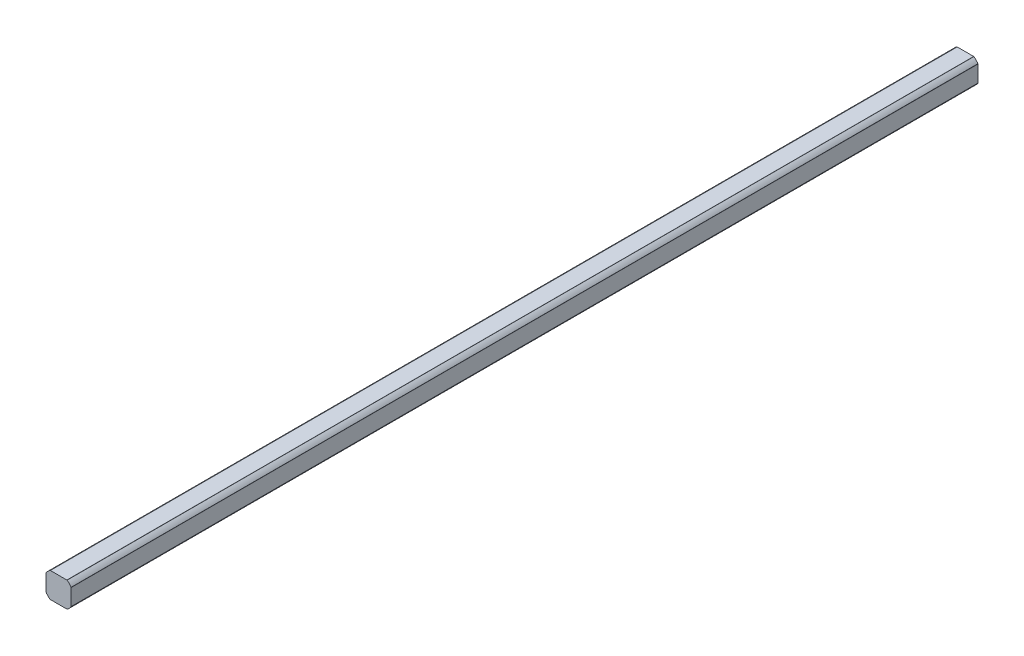
ISO-10303-21;
HEADER;
FILE_DESCRIPTION(('STEP AP214'),'2;1');
FILE_NAME('part.step','',(''),(''),'','','');
FILE_SCHEMA(('AUTOMOTIVE_DESIGN { 1 0 10303 214 1 1 1 1 }'));
ENDSEC;
DATA;
#1=APPLICATION_CONTEXT('core data for automotive mechanical design processes');
#2=APPLICATION_PROTOCOL_DEFINITION('international standard','automotive_design',2000,#1);
#3=PRODUCT_CONTEXT('',#1,'mechanical');
#4=PRODUCT('Part','Part','',(#3));
#5=PRODUCT_RELATED_PRODUCT_CATEGORY('part','',(#4));
#6=PRODUCT_DEFINITION_FORMATION('','',#4);
#7=PRODUCT_DEFINITION_CONTEXT('part definition',#1,'design');
#8=PRODUCT_DEFINITION('design','',#6,#7);
#9=PRODUCT_DEFINITION_SHAPE('','',#8);
#10=(LENGTH_UNIT() NAMED_UNIT(*) SI_UNIT(.MILLI.,.METRE.));
#11=(NAMED_UNIT(*) PLANE_ANGLE_UNIT() SI_UNIT($,.RADIAN.));
#12=(NAMED_UNIT(*) SI_UNIT($,.STERADIAN.) SOLID_ANGLE_UNIT());
#13=UNCERTAINTY_MEASURE_WITH_UNIT(LENGTH_MEASURE(1.E-05),#10,'distance_accuracy_value','');
#14=(GEOMETRIC_REPRESENTATION_CONTEXT(3) GLOBAL_UNCERTAINTY_ASSIGNED_CONTEXT((#13)) GLOBAL_UNIT_ASSIGNED_CONTEXT((#10,
#11,#12)) REPRESENTATION_CONTEXT('',''));
#15=CARTESIAN_POINT('',(0.,0.,0.));
#16=DIRECTION('',(0.,0.,1.));
#17=DIRECTION('',(1.,0.,0.));
#18=AXIS2_PLACEMENT_3D('',#15,#16,#17);
#19=CARTESIAN_POINT('',(0.,0.,304.8));
#20=DIRECTION('',(0.,0.,-1.));
#21=DIRECTION('',(-1.,0.,0.));
#22=AXIS2_PLACEMENT_3D('',#19,#20,#21);
#23=CYLINDRICAL_SURFACE('',#22,3.81);
#24=DIRECTION('',(0.,0.,1.));
#25=VECTOR('',#24,1.);
#26=CARTESIAN_POINT('',(3.15310344827586,-2.13870022314275,304.8));
#27=LINE('',#26,#25);
#28=CARTESIAN_POINT('',(3.15310344827586,-2.13870022314276,38.1));
#29=VERTEX_POINT('',#28);
#30=CARTESIAN_POINT('',(3.15310344827586,-2.13870022314276,266.7));
#31=VERTEX_POINT('',#30);
#32=EDGE_CURVE('E205',#29,#31,#27,.T.);
#33=ORIENTED_EDGE('',*,*,#32,.T.);
#34=CARTESIAN_POINT('',(0.,0.,266.7));
#35=DIRECTION('',(0.,0.,1.));
#36=DIRECTION('',(1.,0.,0.));
#37=AXIS2_PLACEMENT_3D('',#34,#35,#36);
#38=CIRCLE('',#37,3.81);
#39=CARTESIAN_POINT('',(2.13870022314276,-3.15310344827586,266.7));
#40=VERTEX_POINT('',#39);
#41=EDGE_CURVE('E180',#40,#31,#38,.T.);
#42=ORIENTED_EDGE('',*,*,#41,.F.);
#43=DIRECTION('',(0.,0.,-1.));
#44=VECTOR('',#43,1.);
#45=CARTESIAN_POINT('',(2.13870022314275,-3.15310344827586,304.8));
#46=LINE('',#45,#44);
#47=CARTESIAN_POINT('',(2.13870022314275,-3.15310344827586,38.1));
#48=VERTEX_POINT('',#47);
#49=EDGE_CURVE('E67',#40,#48,#46,.T.);
#50=ORIENTED_EDGE('',*,*,#49,.T.);
#51=CARTESIAN_POINT('',(0.,0.,38.1));
#52=DIRECTION('',(0.,0.,1.));
#53=DIRECTION('',(1.,0.,0.));
#54=AXIS2_PLACEMENT_3D('',#51,#52,#53);
#55=CIRCLE('',#54,3.81);
#56=EDGE_CURVE('E276',#48,#29,#55,.T.);
#57=ORIENTED_EDGE('',*,*,#56,.T.);
#58=EDGE_LOOP('',(#33,#42,#50,#57));
#59=FACE_BOUND('',#58,.T.);
#60=ADVANCED_FACE('F42',(#59),#23,.T.);
#61=CARTESIAN_POINT('',(3.175,2.10605674187568,304.8));
#62=DIRECTION('',(-1.,0.,0.));
#63=DIRECTION('',(0.,0.,1.));
#64=AXIS2_PLACEMENT_3D('',#61,#62,#63);
#65=PLANE('',#64);
#66=DIRECTION('',(0.,1.,0.));
#67=VECTOR('',#66,1.);
#68=CARTESIAN_POINT('',(3.175,2.10605674187568,266.7));
#69=LINE('',#68,#67);
#70=CARTESIAN_POINT('',(3.175,-2.06741021570466,266.7));
#71=VERTEX_POINT('',#70);
#72=CARTESIAN_POINT('',(3.175,2.06741021570466,266.7));
#73=VERTEX_POINT('',#72);
#74=EDGE_CURVE('E163',#71,#73,#69,.T.);
#75=ORIENTED_EDGE('',*,*,#74,.F.);
#76=DIRECTION('',(0.,0.,-1.));
#77=VECTOR('',#76,1.);
#78=CARTESIAN_POINT('',(3.175,-2.06741021570466,304.8));
#79=LINE('',#78,#77);
#80=CARTESIAN_POINT('',(3.175,-2.06741021570466,38.1));
#81=VERTEX_POINT('',#80);
#82=EDGE_CURVE('E185',#71,#81,#79,.T.);
#83=ORIENTED_EDGE('',*,*,#82,.T.);
#84=DIRECTION('',(0.,1.,0.));
#85=VECTOR('',#84,1.);
#86=CARTESIAN_POINT('',(3.175,2.10605674187568,38.1));
#87=LINE('',#86,#85);
#88=CARTESIAN_POINT('',(3.175,2.06741021570466,38.1));
#89=VERTEX_POINT('',#88);
#90=EDGE_CURVE('E287',#81,#89,#87,.T.);
#91=ORIENTED_EDGE('',*,*,#90,.T.);
#92=DIRECTION('',(0.,0.,1.));
#93=VECTOR('',#92,1.);
#94=CARTESIAN_POINT('',(3.175,2.06741021570466,304.8));
#95=LINE('',#94,#93);
#96=EDGE_CURVE('E184',#89,#73,#95,.T.);
#97=ORIENTED_EDGE('',*,*,#96,.T.);
#98=EDGE_LOOP('',(#75,#83,#91,#97));
#99=FACE_BOUND('',#98,.T.);
#100=ADVANCED_FACE('F304',(#99),#65,.F.);
#101=CARTESIAN_POINT('',(0.,0.,304.8));
#102=DIRECTION('',(0.,0.,-1.));
#103=DIRECTION('',(-1.,0.,0.));
#104=AXIS2_PLACEMENT_3D('',#101,#102,#103);
#105=CYLINDRICAL_SURFACE('',#104,3.81);
#106=DIRECTION('',(0.,0.,1.));
#107=VECTOR('',#106,1.);
#108=CARTESIAN_POINT('',(2.13870022314275,3.15310344827586,304.8));
#109=LINE('',#108,#107);
#110=CARTESIAN_POINT('',(2.13870022314276,3.15310344827586,38.1));
#111=VERTEX_POINT('',#110);
#112=CARTESIAN_POINT('',(2.13870022314276,3.15310344827586,266.7));
#113=VERTEX_POINT('',#112);
#114=EDGE_CURVE('E177',#111,#113,#109,.T.);
#115=ORIENTED_EDGE('',*,*,#114,.T.);
#116=CARTESIAN_POINT('',(3.15310344827586,2.13870022314276,266.7));
#117=VERTEX_POINT('',#116);
#118=EDGE_CURVE('E160',#117,#113,#38,.T.);
#119=ORIENTED_EDGE('',*,*,#118,.F.);
#120=DIRECTION('',(0.,0.,-1.));
#121=VECTOR('',#120,1.);
#122=CARTESIAN_POINT('',(3.15310344827586,2.13870022314275,304.8));
#123=LINE('',#122,#121);
#124=CARTESIAN_POINT('',(3.15310344827586,2.13870022314276,38.1));
#125=VERTEX_POINT('',#124);
#126=EDGE_CURVE('E174',#117,#125,#123,.T.);
#127=ORIENTED_EDGE('',*,*,#126,.T.);
#128=EDGE_CURVE('E277',#125,#111,#55,.T.);
#129=ORIENTED_EDGE('',*,*,#128,.T.);
#130=EDGE_LOOP('',(#115,#119,#127,#129));
#131=FACE_BOUND('',#130,.T.);
#132=ADVANCED_FACE('F172',(#131),#105,.T.);
#133=CARTESIAN_POINT('',(-2.10605674187568,3.175,304.8));
#134=DIRECTION('',(0.,-1.,0.));
#135=DIRECTION('',(0.,0.,-1.));
#136=AXIS2_PLACEMENT_3D('',#133,#134,#135);
#137=PLANE('',#136);
#138=DIRECTION('',(-1.,0.,0.));
#139=VECTOR('',#138,1.);
#140=CARTESIAN_POINT('',(-2.10605674187568,3.175,266.7));
#141=LINE('',#140,#139);
#142=CARTESIAN_POINT('',(2.06741021570467,3.175,266.7));
#143=VERTEX_POINT('',#142);
#144=CARTESIAN_POINT('',(-2.06741021570466,3.175,266.7));
#145=VERTEX_POINT('',#144);
#146=EDGE_CURVE('E272',#143,#145,#141,.T.);
#147=ORIENTED_EDGE('',*,*,#146,.F.);
#148=DIRECTION('',(0.,0.,-1.));
#149=VECTOR('',#148,1.);
#150=CARTESIAN_POINT('',(2.06741021570466,3.175,304.8));
#151=LINE('',#150,#149);
#152=CARTESIAN_POINT('',(2.06741021570467,3.175,38.1));
#153=VERTEX_POINT('',#152);
#154=EDGE_CURVE('E46',#143,#153,#151,.T.);
#155=ORIENTED_EDGE('',*,*,#154,.T.);
#156=DIRECTION('',(-1.,0.,0.));
#157=VECTOR('',#156,1.);
#158=CARTESIAN_POINT('',(-2.10605674187568,3.175,38.1));
#159=LINE('',#158,#157);
#160=CARTESIAN_POINT('',(-2.06741021570466,3.175,38.1));
#161=VERTEX_POINT('',#160);
#162=EDGE_CURVE('E297',#153,#161,#159,.T.);
#163=ORIENTED_EDGE('',*,*,#162,.T.);
#164=DIRECTION('',(0.,0.,1.));
#165=VECTOR('',#164,1.);
#166=CARTESIAN_POINT('',(-2.06741021570466,3.175,304.8));
#167=LINE('',#166,#165);
#168=EDGE_CURVE('E201',#161,#145,#167,.T.);
#169=ORIENTED_EDGE('',*,*,#168,.T.);
#170=EDGE_LOOP('',(#147,#155,#163,#169));
#171=FACE_BOUND('',#170,.T.);
#172=ADVANCED_FACE('F389',(#171),#137,.F.);
#173=CARTESIAN_POINT('',(0.,0.,304.8));
#174=DIRECTION('',(0.,0.,-1.));
#175=DIRECTION('',(-1.,0.,0.));
#176=AXIS2_PLACEMENT_3D('',#173,#174,#175);
#177=CYLINDRICAL_SURFACE('',#176,3.81);
#178=DIRECTION('',(0.,0.,1.));
#179=VECTOR('',#178,1.);
#180=CARTESIAN_POINT('',(-3.15310344827586,2.13870022314275,304.8));
#181=LINE('',#180,#179);
#182=CARTESIAN_POINT('',(-3.15310344827586,2.13870022314276,38.1));
#183=VERTEX_POINT('',#182);
#184=CARTESIAN_POINT('',(-3.15310344827586,2.13870022314276,266.7));
#185=VERTEX_POINT('',#184);
#186=EDGE_CURVE('E241',#183,#185,#181,.T.);
#187=ORIENTED_EDGE('',*,*,#186,.T.);
#188=CARTESIAN_POINT('',(-2.13870022314276,3.15310344827586,266.7));
#189=VERTEX_POINT('',#188);
#190=EDGE_CURVE('E178',#189,#185,#38,.T.);
#191=ORIENTED_EDGE('',*,*,#190,.F.);
#192=DIRECTION('',(0.,0.,-1.));
#193=VECTOR('',#192,1.);
#194=CARTESIAN_POINT('',(-2.13870022314275,3.15310344827586,304.8));
#195=LINE('',#194,#193);
#196=CARTESIAN_POINT('',(-2.13870022314276,3.15310344827586,38.1));
#197=VERTEX_POINT('',#196);
#198=EDGE_CURVE('E190',#189,#197,#195,.T.);
#199=ORIENTED_EDGE('',*,*,#198,.T.);
#200=EDGE_CURVE('E280',#197,#183,#55,.T.);
#201=ORIENTED_EDGE('',*,*,#200,.T.);
#202=EDGE_LOOP('',(#187,#191,#199,#201));
#203=FACE_BOUND('',#202,.T.);
#204=ADVANCED_FACE('F323',(#203),#177,.T.);
#205=CARTESIAN_POINT('',(-3.175,2.10605674187568,304.8));
#206=DIRECTION('',(1.,0.,0.));
#207=DIRECTION('',(0.,1.,0.));
#208=AXIS2_PLACEMENT_3D('',#205,#206,#207);
#209=PLANE('',#208);
#210=DIRECTION('',(0.,-1.,0.));
#211=VECTOR('',#210,1.);
#212=CARTESIAN_POINT('',(-3.175,2.10605674187568,266.7));
#213=LINE('',#212,#211);
#214=CARTESIAN_POINT('',(-3.175,2.06741021570466,266.7));
#215=VERTEX_POINT('',#214);
#216=CARTESIAN_POINT('',(-3.175,-2.06741021570466,266.7));
#217=VERTEX_POINT('',#216);
#218=EDGE_CURVE('E253',#215,#217,#213,.T.);
#219=ORIENTED_EDGE('',*,*,#218,.F.);
#220=DIRECTION('',(0.,0.,-1.));
#221=VECTOR('',#220,1.);
#222=CARTESIAN_POINT('',(-3.175,2.06741021570466,304.8));
#223=LINE('',#222,#221);
#224=CARTESIAN_POINT('',(-3.175,2.06741021570466,38.1));
#225=VERTEX_POINT('',#224);
#226=EDGE_CURVE('E240',#215,#225,#223,.T.);
#227=ORIENTED_EDGE('',*,*,#226,.T.);
#228=DIRECTION('',(0.,-1.,0.));
#229=VECTOR('',#228,1.);
#230=CARTESIAN_POINT('',(-3.175,2.10605674187568,38.1));
#231=LINE('',#230,#229);
#232=CARTESIAN_POINT('',(-3.175,-2.06741021570466,38.1));
#233=VERTEX_POINT('',#232);
#234=EDGE_CURVE('E254',#225,#233,#231,.T.);
#235=ORIENTED_EDGE('',*,*,#234,.T.);
#236=DIRECTION('',(0.,0.,1.));
#237=VECTOR('',#236,1.);
#238=CARTESIAN_POINT('',(-3.175,-2.06741021570466,304.8));
#239=LINE('',#238,#237);
#240=EDGE_CURVE('E232',#233,#217,#239,.T.);
#241=ORIENTED_EDGE('',*,*,#240,.T.);
#242=EDGE_LOOP('',(#219,#227,#235,#241));
#243=FACE_BOUND('',#242,.T.);
#244=ADVANCED_FACE('F252',(#243),#209,.F.);
#245=CARTESIAN_POINT('',(0.,0.,304.8));
#246=DIRECTION('',(0.,0.,-1.));
#247=DIRECTION('',(-1.,0.,0.));
#248=AXIS2_PLACEMENT_3D('',#245,#246,#247);
#249=CYLINDRICAL_SURFACE('',#248,3.81);
#250=DIRECTION('',(0.,0.,1.));
#251=VECTOR('',#250,1.);
#252=CARTESIAN_POINT('',(-2.13870022314275,-3.15310344827586,304.8));
#253=LINE('',#252,#251);
#254=CARTESIAN_POINT('',(-2.13870022314276,-3.15310344827586,38.1));
#255=VERTEX_POINT('',#254);
#256=CARTESIAN_POINT('',(-2.13870022314276,-3.15310344827586,266.7));
#257=VERTEX_POINT('',#256);
#258=EDGE_CURVE('E228',#255,#257,#253,.T.);
#259=ORIENTED_EDGE('',*,*,#258,.T.);
#260=CARTESIAN_POINT('',(-3.15310344827586,-2.13870022314276,266.7));
#261=VERTEX_POINT('',#260);
#262=EDGE_CURVE('E330',#261,#257,#38,.T.);
#263=ORIENTED_EDGE('',*,*,#262,.F.);
#264=DIRECTION('',(0.,0.,-1.));
#265=VECTOR('',#264,1.);
#266=CARTESIAN_POINT('',(-3.15310344827586,-2.13870022314275,304.8));
#267=LINE('',#266,#265);
#268=CARTESIAN_POINT('',(-3.15310344827586,-2.13870022314276,38.1));
#269=VERTEX_POINT('',#268);
#270=EDGE_CURVE('E231',#261,#269,#267,.T.);
#271=ORIENTED_EDGE('',*,*,#270,.T.);
#272=EDGE_CURVE('E314',#269,#255,#55,.T.);
#273=ORIENTED_EDGE('',*,*,#272,.T.);
#274=EDGE_LOOP('',(#259,#263,#271,#273));
#275=FACE_BOUND('',#274,.T.);
#276=ADVANCED_FACE('F340',(#275),#249,.T.);
#277=CARTESIAN_POINT('',(-2.10605674187568,-3.175,304.8));
#278=DIRECTION('',(0.,1.,0.));
#279=DIRECTION('',(1.,0.,0.));
#280=AXIS2_PLACEMENT_3D('',#277,#278,#279);
#281=PLANE('',#280);
#282=DIRECTION('',(1.,0.,0.));
#283=VECTOR('',#282,1.);
#284=CARTESIAN_POINT('',(-2.10605674187568,-3.175,266.7));
#285=LINE('',#284,#283);
#286=CARTESIAN_POINT('',(-2.06741021570466,-3.175,266.7));
#287=VERTEX_POINT('',#286);
#288=CARTESIAN_POINT('',(2.06741021570466,-3.175,266.7));
#289=VERTEX_POINT('',#288);
#290=EDGE_CURVE('E60',#287,#289,#285,.T.);
#291=ORIENTED_EDGE('',*,*,#290,.F.);
#292=DIRECTION('',(0.,0.,-1.));
#293=VECTOR('',#292,1.);
#294=CARTESIAN_POINT('',(-2.06741021570466,-3.175,304.8));
#295=LINE('',#294,#293);
#296=CARTESIAN_POINT('',(-2.06741021570466,-3.175,38.1));
#297=VERTEX_POINT('',#296);
#298=EDGE_CURVE('E221',#287,#297,#295,.T.);
#299=ORIENTED_EDGE('',*,*,#298,.T.);
#300=DIRECTION('',(1.,0.,0.));
#301=VECTOR('',#300,1.);
#302=CARTESIAN_POINT('',(-2.10605674187568,-3.175,38.1));
#303=LINE('',#302,#301);
#304=CARTESIAN_POINT('',(2.06741021570466,-3.175,38.1));
#305=VERTEX_POINT('',#304);
#306=EDGE_CURVE('E279',#297,#305,#303,.T.);
#307=ORIENTED_EDGE('',*,*,#306,.T.);
#308=DIRECTION('',(0.,0.,1.));
#309=VECTOR('',#308,1.);
#310=CARTESIAN_POINT('',(2.06741021570466,-3.175,304.8));
#311=LINE('',#310,#309);
#312=EDGE_CURVE('E217',#305,#289,#311,.T.);
#313=ORIENTED_EDGE('',*,*,#312,.T.);
#314=EDGE_LOOP('',(#291,#299,#307,#313));
#315=FACE_BOUND('',#314,.T.);
#316=ADVANCED_FACE('F344',(#315),#281,.F.);
#317=CARTESIAN_POINT('',(2.06741021570466,3.048,304.8));
#318=DIRECTION('',(0.,0.,-1.));
#319=DIRECTION('',(-1.,0.,0.));
#320=AXIS2_PLACEMENT_3D('',#317,#318,#319);
#321=CYLINDRICAL_SURFACE('',#320,0.127);
#322=ORIENTED_EDGE('',*,*,#154,.F.);
#323=CARTESIAN_POINT('',(2.06741021570466,3.048,266.7));
#324=DIRECTION('',(0.,0.,1.));
#325=DIRECTION('',(1.,0.,0.));
#326=AXIS2_PLACEMENT_3D('',#323,#324,#325);
#327=CIRCLE('',#326,0.127);
#328=EDGE_CURVE('E274',#143,#113,#327,.F.);
#329=ORIENTED_EDGE('',*,*,#328,.T.);
#330=ORIENTED_EDGE('',*,*,#114,.F.);
#331=CARTESIAN_POINT('',(2.06741021570466,3.048,38.1));
#332=DIRECTION('',(0.,0.,1.));
#333=DIRECTION('',(1.,0.,0.));
#334=AXIS2_PLACEMENT_3D('',#331,#332,#333);
#335=CIRCLE('',#334,0.127);
#336=EDGE_CURVE('E222',#153,#111,#335,.F.);
#337=ORIENTED_EDGE('',*,*,#336,.F.);
#338=EDGE_LOOP('',(#322,#329,#330,#337));
#339=FACE_BOUND('',#338,.T.);
#340=ADVANCED_FACE('F364',(#339),#321,.T.);
#341=CARTESIAN_POINT('',(3.048,2.06741021570466,304.8));
#342=DIRECTION('',(0.,0.,-1.));
#343=DIRECTION('',(-1.,0.,0.));
#344=AXIS2_PLACEMENT_3D('',#341,#342,#343);
#345=CYLINDRICAL_SURFACE('',#344,0.127);
#346=ORIENTED_EDGE('',*,*,#126,.F.);
#347=CARTESIAN_POINT('',(3.048,2.06741021570466,266.7));
#348=DIRECTION('',(0.,0.,1.));
#349=DIRECTION('',(1.,0.,0.));
#350=AXIS2_PLACEMENT_3D('',#347,#348,#349);
#351=CIRCLE('',#350,0.127);
#352=EDGE_CURVE('E157',#117,#73,#351,.F.);
#353=ORIENTED_EDGE('',*,*,#352,.T.);
#354=ORIENTED_EDGE('',*,*,#96,.F.);
#355=CARTESIAN_POINT('',(3.048,2.06741021570466,38.1));
#356=DIRECTION('',(0.,0.,1.));
#357=DIRECTION('',(1.,0.,0.));
#358=AXIS2_PLACEMENT_3D('',#355,#356,#357);
#359=CIRCLE('',#358,0.127);
#360=EDGE_CURVE('E183',#125,#89,#359,.F.);
#361=ORIENTED_EDGE('',*,*,#360,.F.);
#362=EDGE_LOOP('',(#346,#353,#354,#361));
#363=FACE_BOUND('',#362,.T.);
#364=ADVANCED_FACE('F182',(#363),#345,.T.);
#365=CARTESIAN_POINT('',(-2.06741021570466,3.048,304.8));
#366=DIRECTION('',(0.,0.,-1.));
#367=DIRECTION('',(-1.,0.,0.));
#368=AXIS2_PLACEMENT_3D('',#365,#366,#367);
#369=CYLINDRICAL_SURFACE('',#368,0.127);
#370=ORIENTED_EDGE('',*,*,#198,.F.);
#371=CARTESIAN_POINT('',(-2.06741021570466,3.048,266.7));
#372=DIRECTION('',(0.,0.,1.));
#373=DIRECTION('',(1.,0.,0.));
#374=AXIS2_PLACEMENT_3D('',#371,#372,#373);
#375=CIRCLE('',#374,0.127);
#376=EDGE_CURVE('E269',#189,#145,#375,.F.);
#377=ORIENTED_EDGE('',*,*,#376,.T.);
#378=ORIENTED_EDGE('',*,*,#168,.F.);
#379=CARTESIAN_POINT('',(-2.06741021570466,3.048,38.1));
#380=DIRECTION('',(0.,0.,1.));
#381=DIRECTION('',(1.,0.,0.));
#382=AXIS2_PLACEMENT_3D('',#379,#380,#381);
#383=CIRCLE('',#382,0.127);
#384=EDGE_CURVE('E295',#197,#161,#383,.F.);
#385=ORIENTED_EDGE('',*,*,#384,.F.);
#386=EDGE_LOOP('',(#370,#377,#378,#385));
#387=FACE_BOUND('',#386,.T.);
#388=ADVANCED_FACE('F44',(#387),#369,.T.);
#389=CARTESIAN_POINT('',(-3.048,2.06741021570466,304.8));
#390=DIRECTION('',(0.,0.,-1.));
#391=DIRECTION('',(-1.,0.,0.));
#392=AXIS2_PLACEMENT_3D('',#389,#390,#391);
#393=CYLINDRICAL_SURFACE('',#392,0.127);
#394=ORIENTED_EDGE('',*,*,#226,.F.);
#395=CARTESIAN_POINT('',(-3.048,2.06741021570466,266.7));
#396=DIRECTION('',(0.,0.,1.));
#397=DIRECTION('',(1.,0.,0.));
#398=AXIS2_PLACEMENT_3D('',#395,#396,#397);
#399=CIRCLE('',#398,0.127);
#400=EDGE_CURVE('E263',#215,#185,#399,.F.);
#401=ORIENTED_EDGE('',*,*,#400,.T.);
#402=ORIENTED_EDGE('',*,*,#186,.F.);
#403=CARTESIAN_POINT('',(-3.048,2.06741021570466,38.1));
#404=DIRECTION('',(0.,0.,1.));
#405=DIRECTION('',(1.,0.,0.));
#406=AXIS2_PLACEMENT_3D('',#403,#404,#405);
#407=CIRCLE('',#406,0.127);
#408=EDGE_CURVE('E293',#225,#183,#407,.F.);
#409=ORIENTED_EDGE('',*,*,#408,.F.);
#410=EDGE_LOOP('',(#394,#401,#402,#409));
#411=FACE_BOUND('',#410,.T.);
#412=ADVANCED_FACE('F329',(#411),#393,.T.);
#413=CARTESIAN_POINT('',(-3.048,-2.06741021570466,304.8));
#414=DIRECTION('',(0.,0.,-1.));
#415=DIRECTION('',(-1.,0.,0.));
#416=AXIS2_PLACEMENT_3D('',#413,#414,#415);
#417=CYLINDRICAL_SURFACE('',#416,0.127);
#418=ORIENTED_EDGE('',*,*,#270,.F.);
#419=CARTESIAN_POINT('',(-3.048,-2.06741021570466,266.7));
#420=DIRECTION('',(0.,0.,1.));
#421=DIRECTION('',(1.,0.,0.));
#422=AXIS2_PLACEMENT_3D('',#419,#420,#421);
#423=CIRCLE('',#422,0.127);
#424=EDGE_CURVE('E168',#261,#217,#423,.F.);
#425=ORIENTED_EDGE('',*,*,#424,.T.);
#426=ORIENTED_EDGE('',*,*,#240,.F.);
#427=CARTESIAN_POINT('',(-3.048,-2.06741021570466,38.1));
#428=DIRECTION('',(0.,0.,1.));
#429=DIRECTION('',(1.,0.,0.));
#430=AXIS2_PLACEMENT_3D('',#427,#428,#429);
#431=CIRCLE('',#430,0.127);
#432=EDGE_CURVE('E260',#269,#233,#431,.F.);
#433=ORIENTED_EDGE('',*,*,#432,.F.);
#434=EDGE_LOOP('',(#418,#425,#426,#433));
#435=FACE_BOUND('',#434,.T.);
#436=ADVANCED_FACE('F259',(#435),#417,.T.);
#437=CARTESIAN_POINT('',(-2.06741021570466,-3.048,304.8));
#438=DIRECTION('',(0.,0.,-1.));
#439=DIRECTION('',(-1.,0.,0.));
#440=AXIS2_PLACEMENT_3D('',#437,#438,#439);
#441=CYLINDRICAL_SURFACE('',#440,0.127);
#442=ORIENTED_EDGE('',*,*,#298,.F.);
#443=CARTESIAN_POINT('',(-2.06741021570466,-3.048,266.7));
#444=DIRECTION('',(0.,0.,1.));
#445=DIRECTION('',(1.,0.,0.));
#446=AXIS2_PLACEMENT_3D('',#443,#444,#445);
#447=CIRCLE('',#446,0.127);
#448=EDGE_CURVE('E333',#287,#257,#447,.F.);
#449=ORIENTED_EDGE('',*,*,#448,.T.);
#450=ORIENTED_EDGE('',*,*,#258,.F.);
#451=CARTESIAN_POINT('',(-2.06741021570466,-3.048,38.1));
#452=DIRECTION('',(0.,0.,1.));
#453=DIRECTION('',(1.,0.,0.));
#454=AXIS2_PLACEMENT_3D('',#451,#452,#453);
#455=CIRCLE('',#454,0.127);
#456=EDGE_CURVE('E283',#297,#255,#455,.F.);
#457=ORIENTED_EDGE('',*,*,#456,.F.);
#458=EDGE_LOOP('',(#442,#449,#450,#457));
#459=FACE_BOUND('',#458,.T.);
#460=ADVANCED_FACE('F338',(#459),#441,.T.);
#461=CARTESIAN_POINT('',(3.048,-2.06741021570466,304.8));
#462=DIRECTION('',(0.,0.,-1.));
#463=DIRECTION('',(-1.,0.,0.));
#464=AXIS2_PLACEMENT_3D('',#461,#462,#463);
#465=CYLINDRICAL_SURFACE('',#464,0.127);
#466=ORIENTED_EDGE('',*,*,#82,.F.);
#467=CARTESIAN_POINT('',(3.048,-2.06741021570466,266.7));
#468=DIRECTION('',(0.,0.,1.));
#469=DIRECTION('',(1.,0.,0.));
#470=AXIS2_PLACEMENT_3D('',#467,#468,#469);
#471=CIRCLE('',#470,0.127);
#472=EDGE_CURVE('E312',#71,#31,#471,.F.);
#473=ORIENTED_EDGE('',*,*,#472,.T.);
#474=ORIENTED_EDGE('',*,*,#32,.F.);
#475=CARTESIAN_POINT('',(3.048,-2.06741021570466,38.1));
#476=DIRECTION('',(0.,0.,1.));
#477=DIRECTION('',(1.,0.,0.));
#478=AXIS2_PLACEMENT_3D('',#475,#476,#477);
#479=CIRCLE('',#478,0.127);
#480=EDGE_CURVE('E285',#81,#29,#479,.F.);
#481=ORIENTED_EDGE('',*,*,#480,.F.);
#482=EDGE_LOOP('',(#466,#473,#474,#481));
#483=FACE_BOUND('',#482,.T.);
#484=ADVANCED_FACE('F311',(#483),#465,.T.);
#485=CARTESIAN_POINT('',(2.06741021570466,-3.048,304.8));
#486=DIRECTION('',(0.,0.,-1.));
#487=DIRECTION('',(-1.,0.,0.));
#488=AXIS2_PLACEMENT_3D('',#485,#486,#487);
#489=CYLINDRICAL_SURFACE('',#488,0.127);
#490=ORIENTED_EDGE('',*,*,#49,.F.);
#491=CARTESIAN_POINT('',(2.06741021570466,-3.048,266.7));
#492=DIRECTION('',(0.,0.,1.));
#493=DIRECTION('',(1.,0.,0.));
#494=AXIS2_PLACEMENT_3D('',#491,#492,#493);
#495=CIRCLE('',#494,0.127);
#496=EDGE_CURVE('E11',#40,#289,#495,.F.);
#497=ORIENTED_EDGE('',*,*,#496,.T.);
#498=ORIENTED_EDGE('',*,*,#312,.F.);
#499=CARTESIAN_POINT('',(2.06741021570466,-3.048,38.1));
#500=DIRECTION('',(0.,0.,1.));
#501=DIRECTION('',(1.,0.,0.));
#502=AXIS2_PLACEMENT_3D('',#499,#500,#501);
#503=CIRCLE('',#502,0.127);
#504=EDGE_CURVE('E52',#48,#305,#503,.F.);
#505=ORIENTED_EDGE('',*,*,#504,.F.);
#506=EDGE_LOOP('',(#490,#497,#498,#505));
#507=FACE_BOUND('',#506,.T.);
#508=ADVANCED_FACE('F346',(#507),#489,.T.);
#509=CARTESIAN_POINT('',(0.,0.,38.1));
#510=DIRECTION('',(0.,0.,1.));
#511=DIRECTION('',(1.,0.,0.));
#512=AXIS2_PLACEMENT_3D('',#509,#510,#511);
#513=PLANE('',#512);
#514=ORIENTED_EDGE('',*,*,#336,.T.);
#515=ORIENTED_EDGE('',*,*,#128,.F.);
#516=ORIENTED_EDGE('',*,*,#360,.T.);
#517=ORIENTED_EDGE('',*,*,#90,.F.);
#518=ORIENTED_EDGE('',*,*,#480,.T.);
#519=ORIENTED_EDGE('',*,*,#56,.F.);
#520=ORIENTED_EDGE('',*,*,#504,.T.);
#521=ORIENTED_EDGE('',*,*,#306,.F.);
#522=ORIENTED_EDGE('',*,*,#456,.T.);
#523=ORIENTED_EDGE('',*,*,#272,.F.);
#524=ORIENTED_EDGE('',*,*,#432,.T.);
#525=ORIENTED_EDGE('',*,*,#234,.F.);
#526=ORIENTED_EDGE('',*,*,#408,.T.);
#527=ORIENTED_EDGE('',*,*,#200,.F.);
#528=ORIENTED_EDGE('',*,*,#384,.T.);
#529=ORIENTED_EDGE('',*,*,#162,.F.);
#530=EDGE_LOOP('',(#514,#515,#516,#517,#518,#519,#520,#521,#522,#523,#524,#525,#526,#527,#528,#529));
#531=FACE_BOUND('',#530,.T.);
#532=ADVANCED_FACE('F309',(#531),#513,.F.);
#533=CARTESIAN_POINT('',(0.,0.,266.7));
#534=DIRECTION('',(0.,0.,1.));
#535=DIRECTION('',(1.,0.,0.));
#536=AXIS2_PLACEMENT_3D('',#533,#534,#535);
#537=PLANE('',#536);
#538=ORIENTED_EDGE('',*,*,#146,.T.);
#539=ORIENTED_EDGE('',*,*,#376,.F.);
#540=ORIENTED_EDGE('',*,*,#190,.T.);
#541=ORIENTED_EDGE('',*,*,#400,.F.);
#542=ORIENTED_EDGE('',*,*,#218,.T.);
#543=ORIENTED_EDGE('',*,*,#424,.F.);
#544=ORIENTED_EDGE('',*,*,#262,.T.);
#545=ORIENTED_EDGE('',*,*,#448,.F.);
#546=ORIENTED_EDGE('',*,*,#290,.T.);
#547=ORIENTED_EDGE('',*,*,#496,.F.);
#548=ORIENTED_EDGE('',*,*,#41,.T.);
#549=ORIENTED_EDGE('',*,*,#472,.F.);
#550=ORIENTED_EDGE('',*,*,#74,.T.);
#551=ORIENTED_EDGE('',*,*,#352,.F.);
#552=ORIENTED_EDGE('',*,*,#118,.T.);
#553=ORIENTED_EDGE('',*,*,#328,.F.);
#554=EDGE_LOOP('',(#538,#539,#540,#541,#542,#543,#544,#545,#546,#547,#548,#549,#550,#551,#552,#553));
#555=FACE_BOUND('',#554,.T.);
#556=ADVANCED_FACE('F159',(#555),#537,.T.);
#557=CLOSED_SHELL('',(#60,#100,#132,#172,#204,#244,#276,#316,#340,#364,#388,#412,#436,#460,#484,
#508,#532,#556));
#558=MANIFOLD_SOLID_BREP('B2',#557);
#559=ADVANCED_BREP_SHAPE_REPRESENTATION('',(#18,#558),#14);
#560=SHAPE_DEFINITION_REPRESENTATION(#9,#559);
ENDSEC;
END-ISO-10303-21;
